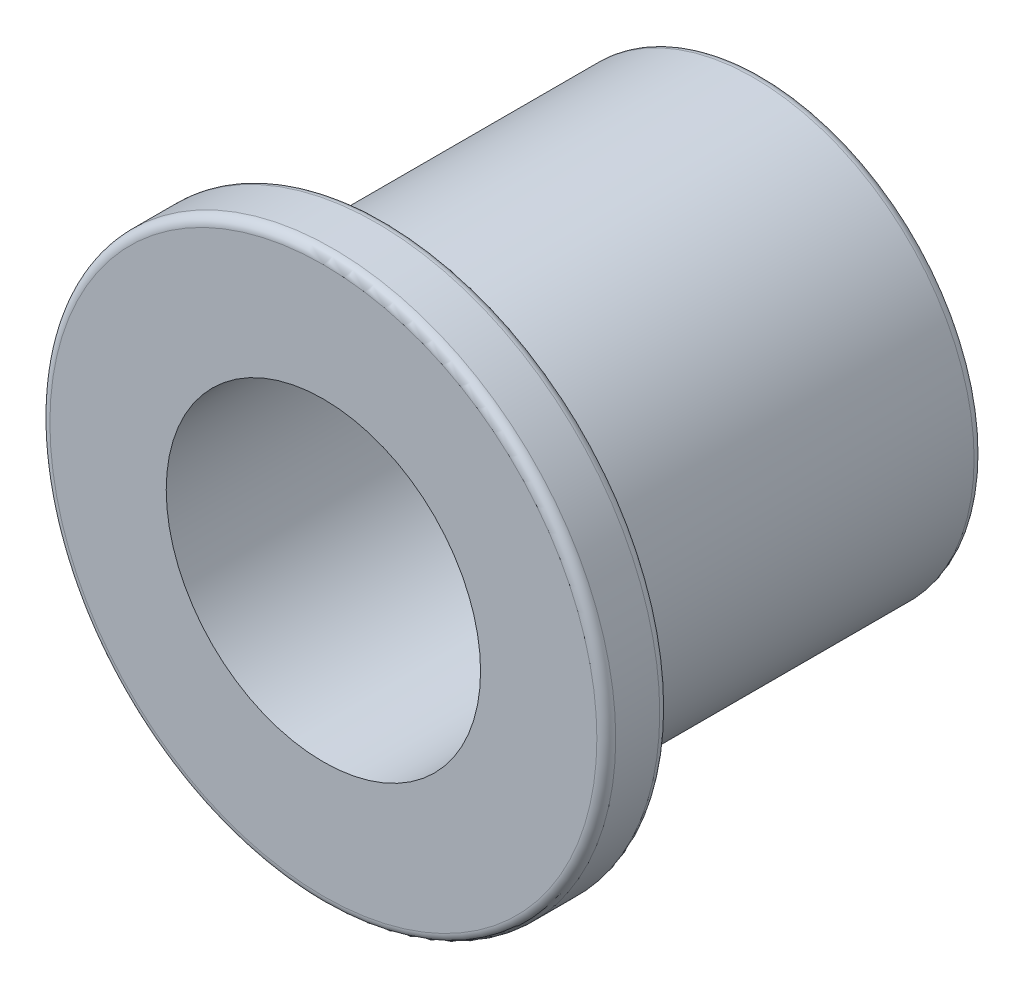
ISO-10303-21;
HEADER;
FILE_DESCRIPTION(('STEP AP214'),'2;1');
FILE_NAME('part.step','',(''),(''),'','','');
FILE_SCHEMA(('AUTOMOTIVE_DESIGN { 1 0 10303 214 1 1 1 1 }'));
ENDSEC;
DATA;
#1=APPLICATION_CONTEXT('core data for automotive mechanical design processes');
#2=APPLICATION_PROTOCOL_DEFINITION('international standard','automotive_design',2000,#1);
#3=PRODUCT_CONTEXT('',#1,'mechanical');
#4=PRODUCT('Part','Part','',(#3));
#5=PRODUCT_RELATED_PRODUCT_CATEGORY('part','',(#4));
#6=PRODUCT_DEFINITION_FORMATION('','',#4);
#7=PRODUCT_DEFINITION_CONTEXT('part definition',#1,'design');
#8=PRODUCT_DEFINITION('design','',#6,#7);
#9=PRODUCT_DEFINITION_SHAPE('','',#8);
#10=(LENGTH_UNIT() NAMED_UNIT(*) SI_UNIT(.MILLI.,.METRE.));
#11=(NAMED_UNIT(*) PLANE_ANGLE_UNIT() SI_UNIT($,.RADIAN.));
#12=(NAMED_UNIT(*) SI_UNIT($,.STERADIAN.) SOLID_ANGLE_UNIT());
#13=UNCERTAINTY_MEASURE_WITH_UNIT(LENGTH_MEASURE(1.E-05),#10,'distance_accuracy_value','');
#14=(GEOMETRIC_REPRESENTATION_CONTEXT(3) GLOBAL_UNCERTAINTY_ASSIGNED_CONTEXT((#13)) GLOBAL_UNIT_ASSIGNED_CONTEXT((#10,
#11,#12)) REPRESENTATION_CONTEXT('',''));
#15=CARTESIAN_POINT('',(0.,0.,0.));
#16=DIRECTION('',(0.,0.,1.));
#17=DIRECTION('',(1.,0.,0.));
#18=AXIS2_PLACEMENT_3D('',#15,#16,#17);
#19=CARTESIAN_POINT('',(0.,0.,0.));
#20=DIRECTION('',(0.,0.,1.));
#21=DIRECTION('',(1.,0.,0.));
#22=AXIS2_PLACEMENT_3D('',#19,#20,#21);
#23=PLANE('',#22);
#24=CARTESIAN_POINT('',(0.,0.,0.));
#25=DIRECTION('',(0.,0.,1.));
#26=DIRECTION('',(1.,0.,0.));
#27=AXIS2_PLACEMENT_3D('',#24,#25,#26);
#28=CIRCLE('',#27,6.7);
#29=CARTESIAN_POINT('',(6.7,0.,0.));
#30=VERTEX_POINT('',#29);
#31=EDGE_CURVE('E10',#30,#30,#28,.F.);
#32=ORIENTED_EDGE('',*,*,#31,.T.);
#33=EDGE_LOOP('',(#32));
#34=FACE_BOUND('',#33,.T.);
#35=CARTESIAN_POINT('',(0.,0.,0.));
#36=DIRECTION('',(0.,0.,1.));
#37=DIRECTION('',(1.,0.,0.));
#38=AXIS2_PLACEMENT_3D('',#35,#36,#37);
#39=CIRCLE('',#38,5.);
#40=CARTESIAN_POINT('',(5.,0.,0.));
#41=VERTEX_POINT('',#40);
#42=EDGE_CURVE('E83',#41,#41,#39,.T.);
#43=ORIENTED_EDGE('',*,*,#42,.T.);
#44=EDGE_LOOP('',(#43));
#45=FACE_BOUND('',#44,.T.);
#46=ADVANCED_FACE('F43',(#34,#45),#23,.F.);
#47=CARTESIAN_POINT('',(0.,0.,12.));
#48=DIRECTION('',(0.,0.,-1.));
#49=DIRECTION('',(-1.,0.,0.));
#50=AXIS2_PLACEMENT_3D('',#47,#48,#49);
#51=CYLINDRICAL_SURFACE('',#50,7.);
#52=CARTESIAN_POINT('',(0.,0.,0.3));
#53=DIRECTION('',(0.,0.,1.));
#54=DIRECTION('',(1.,0.,0.));
#55=AXIS2_PLACEMENT_3D('',#52,#53,#54);
#56=CIRCLE('',#55,7.);
#57=CARTESIAN_POINT('',(7.,0.,0.3));
#58=VERTEX_POINT('',#57);
#59=EDGE_CURVE('E51',#58,#58,#56,.T.);
#60=ORIENTED_EDGE('',*,*,#59,.T.);
#61=EDGE_LOOP('',(#60));
#62=FACE_BOUND('',#61,.T.);
#63=CARTESIAN_POINT('',(0.,0.,11.7));
#64=DIRECTION('',(0.,0.,1.));
#65=DIRECTION('',(1.,0.,0.));
#66=AXIS2_PLACEMENT_3D('',#63,#64,#65);
#67=CIRCLE('',#66,7.);
#68=CARTESIAN_POINT('',(7.,0.,11.7));
#69=VERTEX_POINT('',#68);
#70=EDGE_CURVE('E56',#69,#69,#67,.F.);
#71=ORIENTED_EDGE('',*,*,#70,.T.);
#72=EDGE_LOOP('',(#71));
#73=FACE_BOUND('',#72,.T.);
#74=ADVANCED_FACE('F97',(#62,#73),#51,.T.);
#75=CARTESIAN_POINT('',(0.,0.,12.));
#76=DIRECTION('',(0.,0.,-1.));
#77=DIRECTION('',(-1.,0.,0.));
#78=AXIS2_PLACEMENT_3D('',#75,#76,#77);
#79=CYLINDRICAL_SURFACE('',#78,5.);
#80=ORIENTED_EDGE('',*,*,#42,.F.);
#81=EDGE_LOOP('',(#80));
#82=FACE_BOUND('',#81,.T.);
#83=CARTESIAN_POINT('',(0.,0.,14.));
#84=DIRECTION('',(0.,0.,1.));
#85=DIRECTION('',(1.,0.,0.));
#86=AXIS2_PLACEMENT_3D('',#83,#84,#85);
#87=CIRCLE('',#86,5.);
#88=CARTESIAN_POINT('',(5.,0.,14.));
#89=VERTEX_POINT('',#88);
#90=EDGE_CURVE('E87',#89,#89,#87,.F.);
#91=ORIENTED_EDGE('',*,*,#90,.F.);
#92=EDGE_LOOP('',(#91));
#93=FACE_BOUND('',#92,.T.);
#94=ADVANCED_FACE('F94',(#82,#93),#79,.F.);
#95=CARTESIAN_POINT('',(0.,0.,14.));
#96=DIRECTION('',(0.,0.,-1.));
#97=DIRECTION('',(-1.,0.,0.));
#98=AXIS2_PLACEMENT_3D('',#95,#96,#97);
#99=CYLINDRICAL_SURFACE('',#98,9.);
#100=CARTESIAN_POINT('',(0.,0.,12.3));
#101=DIRECTION('',(0.,0.,1.));
#102=DIRECTION('',(1.,0.,0.));
#103=AXIS2_PLACEMENT_3D('',#100,#101,#102);
#104=CIRCLE('',#103,9.);
#105=CARTESIAN_POINT('',(9.,0.,12.3));
#106=VERTEX_POINT('',#105);
#107=EDGE_CURVE('E75',#106,#106,#104,.T.);
#108=ORIENTED_EDGE('',*,*,#107,.T.);
#109=EDGE_LOOP('',(#108));
#110=FACE_BOUND('',#109,.T.);
#111=CARTESIAN_POINT('',(0.,0.,13.7));
#112=DIRECTION('',(0.,0.,1.));
#113=DIRECTION('',(1.,0.,0.));
#114=AXIS2_PLACEMENT_3D('',#111,#112,#113);
#115=CIRCLE('',#114,9.);
#116=CARTESIAN_POINT('',(9.,0.,13.7));
#117=VERTEX_POINT('',#116);
#118=EDGE_CURVE('E79',#117,#117,#115,.F.);
#119=ORIENTED_EDGE('',*,*,#118,.T.);
#120=EDGE_LOOP('',(#119));
#121=FACE_BOUND('',#120,.T.);
#122=ADVANCED_FACE('F96',(#110,#121),#99,.T.);
#123=CARTESIAN_POINT('',(0.,0.,14.));
#124=DIRECTION('',(0.,0.,1.));
#125=DIRECTION('',(1.,0.,0.));
#126=AXIS2_PLACEMENT_3D('',#123,#124,#125);
#127=PLANE('',#126);
#128=CARTESIAN_POINT('',(0.,0.,14.));
#129=DIRECTION('',(0.,0.,1.));
#130=DIRECTION('',(1.,0.,0.));
#131=AXIS2_PLACEMENT_3D('',#128,#129,#130);
#132=CIRCLE('',#131,8.7);
#133=CARTESIAN_POINT('',(8.7,0.,14.));
#134=VERTEX_POINT('',#133);
#135=EDGE_CURVE('E61',#134,#134,#132,.T.);
#136=ORIENTED_EDGE('',*,*,#135,.T.);
#137=EDGE_LOOP('',(#136));
#138=FACE_BOUND('',#137,.T.);
#139=ORIENTED_EDGE('',*,*,#90,.T.);
#140=EDGE_LOOP('',(#139));
#141=FACE_BOUND('',#140,.T.);
#142=ADVANCED_FACE('F92',(#138,#141),#127,.T.);
#143=CARTESIAN_POINT('',(0.,0.,12.));
#144=DIRECTION('',(0.,0.,1.));
#145=DIRECTION('',(1.,0.,0.));
#146=AXIS2_PLACEMENT_3D('',#143,#144,#145);
#147=PLANE('',#146);
#148=CARTESIAN_POINT('',(0.,0.,12.));
#149=DIRECTION('',(0.,0.,1.));
#150=DIRECTION('',(1.,0.,0.));
#151=AXIS2_PLACEMENT_3D('',#148,#149,#150);
#152=CIRCLE('',#151,8.7);
#153=CARTESIAN_POINT('',(8.7,0.,12.));
#154=VERTEX_POINT('',#153);
#155=EDGE_CURVE('E67',#154,#154,#152,.F.);
#156=ORIENTED_EDGE('',*,*,#155,.T.);
#157=EDGE_LOOP('',(#156));
#158=FACE_BOUND('',#157,.T.);
#159=CARTESIAN_POINT('',(0.,0.,12.));
#160=DIRECTION('',(0.,0.,1.));
#161=DIRECTION('',(1.,0.,0.));
#162=AXIS2_PLACEMENT_3D('',#159,#160,#161);
#163=CIRCLE('',#162,7.3);
#164=CARTESIAN_POINT('',(7.3,0.,12.));
#165=VERTEX_POINT('',#164);
#166=EDGE_CURVE('E71',#165,#165,#163,.T.);
#167=ORIENTED_EDGE('',*,*,#166,.T.);
#168=EDGE_LOOP('',(#167));
#169=FACE_BOUND('',#168,.T.);
#170=ADVANCED_FACE('F118',(#158,#169),#147,.F.);
#171=CARTESIAN_POINT('',(0.,0.,12.3));
#172=DIRECTION('',(0.,0.,1.));
#173=DIRECTION('',(1.,0.,0.));
#174=AXIS2_PLACEMENT_3D('',#171,#172,#173);
#175=TOROIDAL_SURFACE('',#174,8.7,0.3);
#176=ORIENTED_EDGE('',*,*,#155,.F.);
#177=EDGE_LOOP('',(#176));
#178=FACE_BOUND('',#177,.T.);
#179=ORIENTED_EDGE('',*,*,#107,.F.);
#180=EDGE_LOOP('',(#179));
#181=FACE_BOUND('',#180,.T.);
#182=ADVANCED_FACE('F114',(#178,#181),#175,.T.);
#183=CARTESIAN_POINT('',(0.,0.,13.7));
#184=DIRECTION('',(0.,0.,1.));
#185=DIRECTION('',(1.,0.,0.));
#186=AXIS2_PLACEMENT_3D('',#183,#184,#185);
#187=TOROIDAL_SURFACE('',#186,8.7,0.3);
#188=ORIENTED_EDGE('',*,*,#118,.F.);
#189=EDGE_LOOP('',(#188));
#190=FACE_BOUND('',#189,.T.);
#191=ORIENTED_EDGE('',*,*,#135,.F.);
#192=EDGE_LOOP('',(#191));
#193=FACE_BOUND('',#192,.T.);
#194=ADVANCED_FACE('F117',(#190,#193),#187,.T.);
#195=CARTESIAN_POINT('',(0.,0.,0.3));
#196=DIRECTION('',(0.,0.,1.));
#197=DIRECTION('',(1.,0.,0.));
#198=AXIS2_PLACEMENT_3D('',#195,#196,#197);
#199=TOROIDAL_SURFACE('',#198,6.7,0.3);
#200=ORIENTED_EDGE('',*,*,#31,.F.);
#201=EDGE_LOOP('',(#200));
#202=FACE_BOUND('',#201,.T.);
#203=ORIENTED_EDGE('',*,*,#59,.F.);
#204=EDGE_LOOP('',(#203));
#205=FACE_BOUND('',#204,.T.);
#206=ADVANCED_FACE('F121',(#202,#205),#199,.T.);
#207=CARTESIAN_POINT('',(0.,0.,11.7));
#208=DIRECTION('',(0.,0.,1.));
#209=DIRECTION('',(1.,0.,0.));
#210=AXIS2_PLACEMENT_3D('',#207,#208,#209);
#211=TOROIDAL_SURFACE('',#210,7.3,0.3);
#212=ORIENTED_EDGE('',*,*,#70,.F.);
#213=EDGE_LOOP('',(#212));
#214=FACE_BOUND('',#213,.T.);
#215=ORIENTED_EDGE('',*,*,#166,.F.);
#216=EDGE_LOOP('',(#215));
#217=FACE_BOUND('',#216,.T.);
#218=ADVANCED_FACE('F45',(#214,#217),#211,.F.);
#219=CLOSED_SHELL('',(#46,#74,#94,#122,#142,#170,#182,#194,#206,#218));
#220=MANIFOLD_SOLID_BREP('B2',#219);
#221=ADVANCED_BREP_SHAPE_REPRESENTATION('',(#18,#220),#14);
#222=SHAPE_DEFINITION_REPRESENTATION(#9,#221);
ENDSEC;
END-ISO-10303-21;
